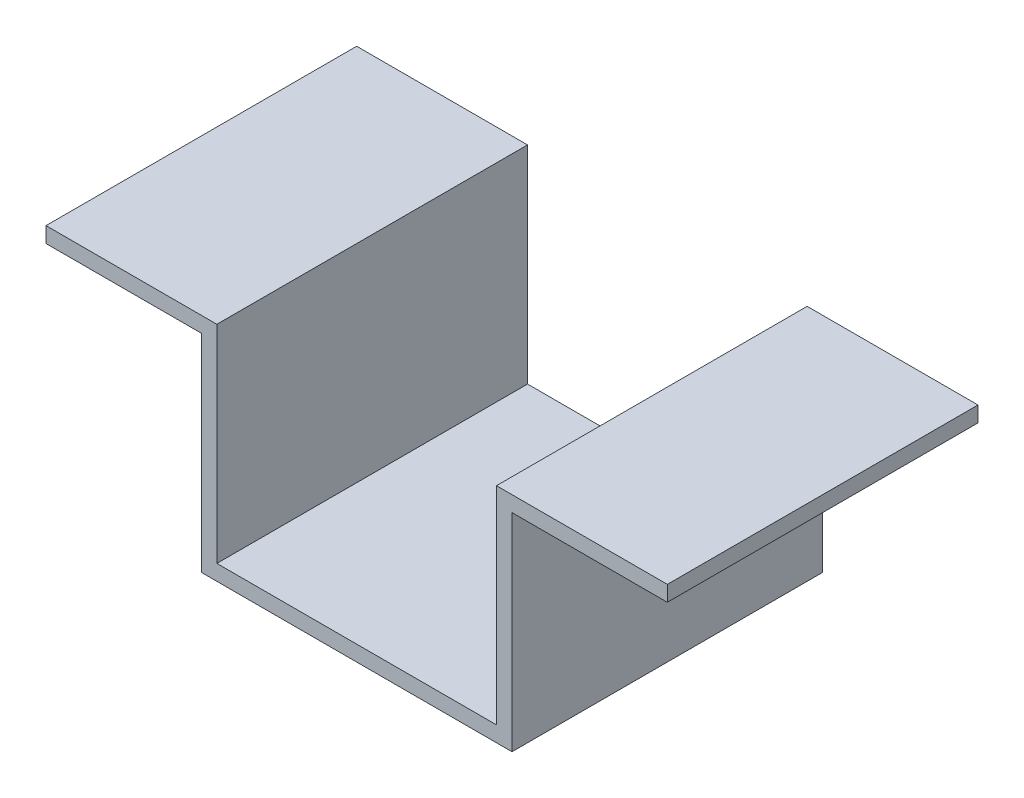
ISO-10303-21;
HEADER;
FILE_DESCRIPTION(('STEP AP214'),'2;1');
FILE_NAME('part.step','',(''),(''),'','','');
FILE_SCHEMA(('AUTOMOTIVE_DESIGN { 1 0 10303 214 1 1 1 1 }'));
ENDSEC;
DATA;
#1=APPLICATION_CONTEXT('core data for automotive mechanical design processes');
#2=APPLICATION_PROTOCOL_DEFINITION('international standard','automotive_design',2000,#1);
#3=PRODUCT_CONTEXT('',#1,'mechanical');
#4=PRODUCT('Part','Part','',(#3));
#5=PRODUCT_RELATED_PRODUCT_CATEGORY('part','',(#4));
#6=PRODUCT_DEFINITION_FORMATION('','',#4);
#7=PRODUCT_DEFINITION_CONTEXT('part definition',#1,'design');
#8=PRODUCT_DEFINITION('design','',#6,#7);
#9=PRODUCT_DEFINITION_SHAPE('','',#8);
#10=(LENGTH_UNIT() NAMED_UNIT(*) SI_UNIT(.MILLI.,.METRE.));
#11=(NAMED_UNIT(*) PLANE_ANGLE_UNIT() SI_UNIT($,.RADIAN.));
#12=(NAMED_UNIT(*) SI_UNIT($,.STERADIAN.) SOLID_ANGLE_UNIT());
#13=UNCERTAINTY_MEASURE_WITH_UNIT(LENGTH_MEASURE(1.E-05),#10,'distance_accuracy_value','');
#14=(GEOMETRIC_REPRESENTATION_CONTEXT(3) GLOBAL_UNCERTAINTY_ASSIGNED_CONTEXT((#13)) GLOBAL_UNIT_ASSIGNED_CONTEXT((#10,
#11,#12)) REPRESENTATION_CONTEXT('',''));
#15=CARTESIAN_POINT('',(0.,0.,0.));
#16=DIRECTION('',(0.,0.,1.));
#17=DIRECTION('',(1.,0.,0.));
#18=AXIS2_PLACEMENT_3D('',#15,#16,#17);
#19=CARTESIAN_POINT('',(-30.,11.5,30.));
#20=DIRECTION('',(1.,0.,0.));
#21=DIRECTION('',(0.,0.,-1.));
#22=AXIS2_PLACEMENT_3D('',#19,#20,#21);
#23=PLANE('',#22);
#24=DIRECTION('',(0.,-1.,0.));
#25=VECTOR('',#24,1.);
#26=CARTESIAN_POINT('',(-30.,11.5,0.));
#27=LINE('',#26,#25);
#28=CARTESIAN_POINT('',(-30.,11.5,0.));
#29=VERTEX_POINT('',#28);
#30=CARTESIAN_POINT('',(-30.,10.,0.));
#31=VERTEX_POINT('',#30);
#32=EDGE_CURVE('E169',#29,#31,#27,.T.);
#33=ORIENTED_EDGE('',*,*,#32,.T.);
#34=DIRECTION('',(0.,0.,-1.));
#35=VECTOR('',#34,1.);
#36=CARTESIAN_POINT('',(-30.,10.,30.));
#37=LINE('',#36,#35);
#38=CARTESIAN_POINT('',(-30.,10.,30.));
#39=VERTEX_POINT('',#38);
#40=EDGE_CURVE('E11',#39,#31,#37,.T.);
#41=ORIENTED_EDGE('',*,*,#40,.F.);
#42=DIRECTION('',(0.,-1.,0.));
#43=VECTOR('',#42,1.);
#44=CARTESIAN_POINT('',(-30.,11.5,30.));
#45=LINE('',#44,#43);
#46=CARTESIAN_POINT('',(-30.,11.5,30.));
#47=VERTEX_POINT('',#46);
#48=EDGE_CURVE('E205',#47,#39,#45,.T.);
#49=ORIENTED_EDGE('',*,*,#48,.F.);
#50=DIRECTION('',(0.,0.,-1.));
#51=VECTOR('',#50,1.);
#52=CARTESIAN_POINT('',(-30.,11.5,30.));
#53=LINE('',#52,#51);
#54=EDGE_CURVE('E165',#47,#29,#53,.T.);
#55=ORIENTED_EDGE('',*,*,#54,.T.);
#56=EDGE_LOOP('',(#33,#41,#49,#55));
#57=FACE_BOUND('',#56,.T.);
#58=ADVANCED_FACE('F45',(#57),#23,.F.);
#59=CARTESIAN_POINT('',(-30.,10.,30.));
#60=DIRECTION('',(0.,1.,0.));
#61=DIRECTION('',(0.,0.,1.));
#62=AXIS2_PLACEMENT_3D('',#59,#60,#61);
#63=PLANE('',#62);
#64=DIRECTION('',(1.,0.,0.));
#65=VECTOR('',#64,1.);
#66=CARTESIAN_POINT('',(-30.,10.,0.));
#67=LINE('',#66,#65);
#68=CARTESIAN_POINT('',(-15.,10.,0.));
#69=VERTEX_POINT('',#68);
#70=EDGE_CURVE('E173',#31,#69,#67,.T.);
#71=ORIENTED_EDGE('',*,*,#70,.T.);
#72=DIRECTION('',(0.,0.,-1.));
#73=VECTOR('',#72,1.);
#74=CARTESIAN_POINT('',(-15.,10.,30.));
#75=LINE('',#74,#73);
#76=CARTESIAN_POINT('',(-15.,10.,30.));
#77=VERTEX_POINT('',#76);
#78=EDGE_CURVE('E54',#77,#69,#75,.T.);
#79=ORIENTED_EDGE('',*,*,#78,.F.);
#80=DIRECTION('',(1.,0.,0.));
#81=VECTOR('',#80,1.);
#82=CARTESIAN_POINT('',(-30.,10.,30.));
#83=LINE('',#82,#81);
#84=EDGE_CURVE('E117',#39,#77,#83,.T.);
#85=ORIENTED_EDGE('',*,*,#84,.F.);
#86=ORIENTED_EDGE('',*,*,#40,.T.);
#87=EDGE_LOOP('',(#71,#79,#85,#86));
#88=FACE_BOUND('',#87,.T.);
#89=ADVANCED_FACE('F299',(#88),#63,.F.);
#90=CARTESIAN_POINT('',(-15.,10.,30.));
#91=DIRECTION('',(1.,0.,0.));
#92=DIRECTION('',(0.,1.,0.));
#93=AXIS2_PLACEMENT_3D('',#90,#91,#92);
#94=PLANE('',#93);
#95=DIRECTION('',(0.,-1.,0.));
#96=VECTOR('',#95,1.);
#97=CARTESIAN_POINT('',(-15.,10.,0.));
#98=LINE('',#97,#96);
#99=CARTESIAN_POINT('',(-15.,-10.,0.));
#100=VERTEX_POINT('',#99);
#101=EDGE_CURVE('E176',#69,#100,#98,.T.);
#102=ORIENTED_EDGE('',*,*,#101,.T.);
#103=DIRECTION('',(0.,0.,-1.));
#104=VECTOR('',#103,1.);
#105=CARTESIAN_POINT('',(-15.,-10.,30.));
#106=LINE('',#105,#104);
#107=CARTESIAN_POINT('',(-15.,-10.,30.));
#108=VERTEX_POINT('',#107);
#109=EDGE_CURVE('E232',#108,#100,#106,.T.);
#110=ORIENTED_EDGE('',*,*,#109,.F.);
#111=DIRECTION('',(0.,-1.,0.));
#112=VECTOR('',#111,1.);
#113=CARTESIAN_POINT('',(-15.,10.,30.));
#114=LINE('',#113,#112);
#115=EDGE_CURVE('E242',#77,#108,#114,.T.);
#116=ORIENTED_EDGE('',*,*,#115,.F.);
#117=ORIENTED_EDGE('',*,*,#78,.T.);
#118=EDGE_LOOP('',(#102,#110,#116,#117));
#119=FACE_BOUND('',#118,.T.);
#120=ADVANCED_FACE('F240',(#119),#94,.F.);
#121=CARTESIAN_POINT('',(15.,-10.,30.));
#122=DIRECTION('',(0.,1.,0.));
#123=DIRECTION('',(0.,0.,1.));
#124=AXIS2_PLACEMENT_3D('',#121,#122,#123);
#125=PLANE('',#124);
#126=DIRECTION('',(1.,0.,0.));
#127=VECTOR('',#126,1.);
#128=CARTESIAN_POINT('',(15.,-10.,0.));
#129=LINE('',#128,#127);
#130=CARTESIAN_POINT('',(15.,-10.,0.));
#131=VERTEX_POINT('',#130);
#132=EDGE_CURVE('E180',#100,#131,#129,.T.);
#133=ORIENTED_EDGE('',*,*,#132,.T.);
#134=DIRECTION('',(0.,0.,-1.));
#135=VECTOR('',#134,1.);
#136=CARTESIAN_POINT('',(15.,-10.,30.));
#137=LINE('',#136,#135);
#138=CARTESIAN_POINT('',(15.,-10.,30.));
#139=VERTEX_POINT('',#138);
#140=EDGE_CURVE('E228',#139,#131,#137,.T.);
#141=ORIENTED_EDGE('',*,*,#140,.F.);
#142=DIRECTION('',(1.,0.,0.));
#143=VECTOR('',#142,1.);
#144=CARTESIAN_POINT('',(-15.,-10.,30.));
#145=LINE('',#144,#143);
#146=EDGE_CURVE('E260',#108,#139,#145,.T.);
#147=ORIENTED_EDGE('',*,*,#146,.F.);
#148=ORIENTED_EDGE('',*,*,#109,.T.);
#149=EDGE_LOOP('',(#133,#141,#147,#148));
#150=FACE_BOUND('',#149,.T.);
#151=ADVANCED_FACE('F250',(#150),#125,.F.);
#152=CARTESIAN_POINT('',(15.,10.,30.));
#153=DIRECTION('',(-1.,0.,0.));
#154=DIRECTION('',(0.,-1.,0.));
#155=AXIS2_PLACEMENT_3D('',#152,#153,#154);
#156=PLANE('',#155);
#157=DIRECTION('',(0.,1.,0.));
#158=VECTOR('',#157,1.);
#159=CARTESIAN_POINT('',(15.,10.,0.));
#160=LINE('',#159,#158);
#161=CARTESIAN_POINT('',(15.,10.,0.));
#162=VERTEX_POINT('',#161);
#163=EDGE_CURVE('E183',#131,#162,#160,.T.);
#164=ORIENTED_EDGE('',*,*,#163,.T.);
#165=DIRECTION('',(0.,0.,-1.));
#166=VECTOR('',#165,1.);
#167=CARTESIAN_POINT('',(15.,10.,30.));
#168=LINE('',#167,#166);
#169=CARTESIAN_POINT('',(15.,10.,30.));
#170=VERTEX_POINT('',#169);
#171=EDGE_CURVE('E224',#170,#162,#168,.T.);
#172=ORIENTED_EDGE('',*,*,#171,.F.);
#173=DIRECTION('',(0.,1.,0.));
#174=VECTOR('',#173,1.);
#175=CARTESIAN_POINT('',(15.,10.,30.));
#176=LINE('',#175,#174);
#177=EDGE_CURVE('E256',#139,#170,#176,.T.);
#178=ORIENTED_EDGE('',*,*,#177,.F.);
#179=ORIENTED_EDGE('',*,*,#140,.T.);
#180=EDGE_LOOP('',(#164,#172,#178,#179));
#181=FACE_BOUND('',#180,.T.);
#182=ADVANCED_FACE('F254',(#181),#156,.F.);
#183=CARTESIAN_POINT('',(30.,10.,30.));
#184=DIRECTION('',(0.,1.,0.));
#185=DIRECTION('',(0.,0.,1.));
#186=AXIS2_PLACEMENT_3D('',#183,#184,#185);
#187=PLANE('',#186);
#188=DIRECTION('',(1.,0.,0.));
#189=VECTOR('',#188,1.);
#190=CARTESIAN_POINT('',(30.,10.,0.));
#191=LINE('',#190,#189);
#192=CARTESIAN_POINT('',(30.,10.,0.));
#193=VERTEX_POINT('',#192);
#194=EDGE_CURVE('E186',#162,#193,#191,.T.);
#195=ORIENTED_EDGE('',*,*,#194,.T.);
#196=DIRECTION('',(0.,0.,-1.));
#197=VECTOR('',#196,1.);
#198=CARTESIAN_POINT('',(30.,10.,30.));
#199=LINE('',#198,#197);
#200=CARTESIAN_POINT('',(30.,10.,30.));
#201=VERTEX_POINT('',#200);
#202=EDGE_CURVE('E220',#201,#193,#199,.T.);
#203=ORIENTED_EDGE('',*,*,#202,.F.);
#204=DIRECTION('',(1.,0.,0.));
#205=VECTOR('',#204,1.);
#206=CARTESIAN_POINT('',(30.,10.,30.));
#207=LINE('',#206,#205);
#208=EDGE_CURVE('E259',#170,#201,#207,.T.);
#209=ORIENTED_EDGE('',*,*,#208,.F.);
#210=ORIENTED_EDGE('',*,*,#171,.T.);
#211=EDGE_LOOP('',(#195,#203,#209,#210));
#212=FACE_BOUND('',#211,.T.);
#213=ADVANCED_FACE('F312',(#212),#187,.F.);
#214=CARTESIAN_POINT('',(30.,11.5,30.));
#215=DIRECTION('',(-1.,0.,0.));
#216=DIRECTION('',(0.,0.,1.));
#217=AXIS2_PLACEMENT_3D('',#214,#215,#216);
#218=PLANE('',#217);
#219=DIRECTION('',(0.,1.,0.));
#220=VECTOR('',#219,1.);
#221=CARTESIAN_POINT('',(30.,11.5,0.));
#222=LINE('',#221,#220);
#223=CARTESIAN_POINT('',(30.,11.5,0.));
#224=VERTEX_POINT('',#223);
#225=EDGE_CURVE('E189',#193,#224,#222,.T.);
#226=ORIENTED_EDGE('',*,*,#225,.T.);
#227=DIRECTION('',(0.,0.,-1.));
#228=VECTOR('',#227,1.);
#229=CARTESIAN_POINT('',(30.,11.5,30.));
#230=LINE('',#229,#228);
#231=CARTESIAN_POINT('',(30.,11.5,30.));
#232=VERTEX_POINT('',#231);
#233=EDGE_CURVE('E216',#232,#224,#230,.T.);
#234=ORIENTED_EDGE('',*,*,#233,.F.);
#235=DIRECTION('',(0.,1.,0.));
#236=VECTOR('',#235,1.);
#237=CARTESIAN_POINT('',(30.,11.5,30.));
#238=LINE('',#237,#236);
#239=EDGE_CURVE('E264',#201,#232,#238,.T.);
#240=ORIENTED_EDGE('',*,*,#239,.F.);
#241=ORIENTED_EDGE('',*,*,#202,.T.);
#242=EDGE_LOOP('',(#226,#234,#240,#241));
#243=FACE_BOUND('',#242,.T.);
#244=ADVANCED_FACE('F315',(#243),#218,.F.);
#245=CARTESIAN_POINT('',(30.,11.5,30.));
#246=DIRECTION('',(0.,-1.,0.));
#247=DIRECTION('',(0.,0.,-1.));
#248=AXIS2_PLACEMENT_3D('',#245,#246,#247);
#249=PLANE('',#248);
#250=DIRECTION('',(-1.,0.,0.));
#251=VECTOR('',#250,1.);
#252=CARTESIAN_POINT('',(30.,11.5,0.));
#253=LINE('',#252,#251);
#254=CARTESIAN_POINT('',(13.5,11.5,0.));
#255=VERTEX_POINT('',#254);
#256=EDGE_CURVE('E192',#224,#255,#253,.T.);
#257=ORIENTED_EDGE('',*,*,#256,.T.);
#258=DIRECTION('',(0.,0.,-1.));
#259=VECTOR('',#258,1.);
#260=CARTESIAN_POINT('',(13.5,11.5,30.));
#261=LINE('',#260,#259);
#262=CARTESIAN_POINT('',(13.5,11.5,30.));
#263=VERTEX_POINT('',#262);
#264=EDGE_CURVE('E212',#263,#255,#261,.T.);
#265=ORIENTED_EDGE('',*,*,#264,.F.);
#266=DIRECTION('',(-1.,0.,0.));
#267=VECTOR('',#266,1.);
#268=CARTESIAN_POINT('',(30.,11.5,30.));
#269=LINE('',#268,#267);
#270=EDGE_CURVE('E271',#232,#263,#269,.T.);
#271=ORIENTED_EDGE('',*,*,#270,.F.);
#272=ORIENTED_EDGE('',*,*,#233,.T.);
#273=EDGE_LOOP('',(#257,#265,#271,#272));
#274=FACE_BOUND('',#273,.T.);
#275=ADVANCED_FACE('F279',(#274),#249,.F.);
#276=CARTESIAN_POINT('',(13.5,11.5,30.));
#277=DIRECTION('',(1.,0.,0.));
#278=DIRECTION('',(0.,1.,0.));
#279=AXIS2_PLACEMENT_3D('',#276,#277,#278);
#280=PLANE('',#279);
#281=DIRECTION('',(0.,-1.,0.));
#282=VECTOR('',#281,1.);
#283=CARTESIAN_POINT('',(13.5,11.5,0.));
#284=LINE('',#283,#282);
#285=CARTESIAN_POINT('',(13.5,-8.5,0.));
#286=VERTEX_POINT('',#285);
#287=EDGE_CURVE('E195',#255,#286,#284,.T.);
#288=ORIENTED_EDGE('',*,*,#287,.T.);
#289=DIRECTION('',(0.,0.,-1.));
#290=VECTOR('',#289,1.);
#291=CARTESIAN_POINT('',(13.5,-8.5,30.));
#292=LINE('',#291,#290);
#293=CARTESIAN_POINT('',(13.5,-8.5,30.));
#294=VERTEX_POINT('',#293);
#295=EDGE_CURVE('E158',#294,#286,#292,.T.);
#296=ORIENTED_EDGE('',*,*,#295,.F.);
#297=DIRECTION('',(0.,-1.,0.));
#298=VECTOR('',#297,1.);
#299=CARTESIAN_POINT('',(13.5,11.5,30.));
#300=LINE('',#299,#298);
#301=EDGE_CURVE('E148',#263,#294,#300,.T.);
#302=ORIENTED_EDGE('',*,*,#301,.F.);
#303=ORIENTED_EDGE('',*,*,#264,.T.);
#304=EDGE_LOOP('',(#288,#296,#302,#303));
#305=FACE_BOUND('',#304,.T.);
#306=ADVANCED_FACE('F283',(#305),#280,.F.);
#307=CARTESIAN_POINT('',(-13.5,-8.5,30.));
#308=DIRECTION('',(0.,-1.,0.));
#309=DIRECTION('',(0.,0.,-1.));
#310=AXIS2_PLACEMENT_3D('',#307,#308,#309);
#311=PLANE('',#310);
#312=DIRECTION('',(-1.,0.,0.));
#313=VECTOR('',#312,1.);
#314=CARTESIAN_POINT('',(-13.5,-8.5,0.));
#315=LINE('',#314,#313);
#316=CARTESIAN_POINT('',(-13.5,-8.5,0.));
#317=VERTEX_POINT('',#316);
#318=EDGE_CURVE('E156',#286,#317,#315,.T.);
#319=ORIENTED_EDGE('',*,*,#318,.T.);
#320=DIRECTION('',(0.,0.,-1.));
#321=VECTOR('',#320,1.);
#322=CARTESIAN_POINT('',(-13.5,-8.5,30.));
#323=LINE('',#322,#321);
#324=CARTESIAN_POINT('',(-13.5,-8.5,30.));
#325=VERTEX_POINT('',#324);
#326=EDGE_CURVE('E154',#325,#317,#323,.T.);
#327=ORIENTED_EDGE('',*,*,#326,.F.);
#328=DIRECTION('',(-1.,0.,0.));
#329=VECTOR('',#328,1.);
#330=CARTESIAN_POINT('',(13.5,-8.5,30.));
#331=LINE('',#330,#329);
#332=EDGE_CURVE('E142',#294,#325,#331,.T.);
#333=ORIENTED_EDGE('',*,*,#332,.F.);
#334=ORIENTED_EDGE('',*,*,#295,.T.);
#335=EDGE_LOOP('',(#319,#327,#333,#334));
#336=FACE_BOUND('',#335,.T.);
#337=ADVANCED_FACE('F155',(#336),#311,.F.);
#338=CARTESIAN_POINT('',(-13.5,11.5,30.));
#339=DIRECTION('',(-1.,0.,0.));
#340=DIRECTION('',(0.,-1.,0.));
#341=AXIS2_PLACEMENT_3D('',#338,#339,#340);
#342=PLANE('',#341);
#343=DIRECTION('',(0.,1.,0.));
#344=VECTOR('',#343,1.);
#345=CARTESIAN_POINT('',(-13.5,11.5,0.));
#346=LINE('',#345,#344);
#347=CARTESIAN_POINT('',(-13.5,11.5,0.));
#348=VERTEX_POINT('',#347);
#349=EDGE_CURVE('E103',#317,#348,#346,.T.);
#350=ORIENTED_EDGE('',*,*,#349,.T.);
#351=DIRECTION('',(0.,0.,-1.));
#352=VECTOR('',#351,1.);
#353=CARTESIAN_POINT('',(-13.5,11.5,30.));
#354=LINE('',#353,#352);
#355=CARTESIAN_POINT('',(-13.5,11.5,30.));
#356=VERTEX_POINT('',#355);
#357=EDGE_CURVE('E159',#356,#348,#354,.T.);
#358=ORIENTED_EDGE('',*,*,#357,.F.);
#359=DIRECTION('',(0.,1.,0.));
#360=VECTOR('',#359,1.);
#361=CARTESIAN_POINT('',(-13.5,11.5,30.));
#362=LINE('',#361,#360);
#363=EDGE_CURVE('E146',#325,#356,#362,.T.);
#364=ORIENTED_EDGE('',*,*,#363,.F.);
#365=ORIENTED_EDGE('',*,*,#326,.T.);
#366=EDGE_LOOP('',(#350,#358,#364,#365));
#367=FACE_BOUND('',#366,.T.);
#368=ADVANCED_FACE('F161',(#367),#342,.F.);
#369=CARTESIAN_POINT('',(-30.,11.5,30.));
#370=DIRECTION('',(0.,-1.,0.));
#371=DIRECTION('',(0.,0.,-1.));
#372=AXIS2_PLACEMENT_3D('',#369,#370,#371);
#373=PLANE('',#372);
#374=DIRECTION('',(-1.,0.,0.));
#375=VECTOR('',#374,1.);
#376=CARTESIAN_POINT('',(-30.,11.5,0.));
#377=LINE('',#376,#375);
#378=EDGE_CURVE('E109',#348,#29,#377,.T.);
#379=ORIENTED_EDGE('',*,*,#378,.T.);
#380=ORIENTED_EDGE('',*,*,#54,.F.);
#381=DIRECTION('',(-1.,0.,0.));
#382=VECTOR('',#381,1.);
#383=CARTESIAN_POINT('',(-30.,11.5,30.));
#384=LINE('',#383,#382);
#385=EDGE_CURVE('E62',#356,#47,#384,.T.);
#386=ORIENTED_EDGE('',*,*,#385,.F.);
#387=ORIENTED_EDGE('',*,*,#357,.T.);
#388=EDGE_LOOP('',(#379,#380,#386,#387));
#389=FACE_BOUND('',#388,.T.);
#390=ADVANCED_FACE('F288',(#389),#373,.F.);
#391=CARTESIAN_POINT('',(0.,0.,30.));
#392=DIRECTION('',(0.,0.,1.));
#393=DIRECTION('',(1.,0.,0.));
#394=AXIS2_PLACEMENT_3D('',#391,#392,#393);
#395=PLANE('',#394);
#396=ORIENTED_EDGE('',*,*,#48,.T.);
#397=ORIENTED_EDGE('',*,*,#84,.T.);
#398=ORIENTED_EDGE('',*,*,#115,.T.);
#399=ORIENTED_EDGE('',*,*,#146,.T.);
#400=ORIENTED_EDGE('',*,*,#177,.T.);
#401=ORIENTED_EDGE('',*,*,#208,.T.);
#402=ORIENTED_EDGE('',*,*,#239,.T.);
#403=ORIENTED_EDGE('',*,*,#270,.T.);
#404=ORIENTED_EDGE('',*,*,#301,.T.);
#405=ORIENTED_EDGE('',*,*,#332,.T.);
#406=ORIENTED_EDGE('',*,*,#363,.T.);
#407=ORIENTED_EDGE('',*,*,#385,.T.);
#408=EDGE_LOOP('',(#396,#397,#398,#399,#400,#401,#402,#403,#404,#405,#406,#407));
#409=FACE_BOUND('',#408,.T.);
#410=ADVANCED_FACE('F144',(#409),#395,.T.);
#411=CARTESIAN_POINT('',(0.,0.,0.));
#412=DIRECTION('',(0.,0.,1.));
#413=DIRECTION('',(1.,0.,0.));
#414=AXIS2_PLACEMENT_3D('',#411,#412,#413);
#415=PLANE('',#414);
#416=ORIENTED_EDGE('',*,*,#32,.F.);
#417=ORIENTED_EDGE('',*,*,#378,.F.);
#418=ORIENTED_EDGE('',*,*,#349,.F.);
#419=ORIENTED_EDGE('',*,*,#318,.F.);
#420=ORIENTED_EDGE('',*,*,#287,.F.);
#421=ORIENTED_EDGE('',*,*,#256,.F.);
#422=ORIENTED_EDGE('',*,*,#225,.F.);
#423=ORIENTED_EDGE('',*,*,#194,.F.);
#424=ORIENTED_EDGE('',*,*,#163,.F.);
#425=ORIENTED_EDGE('',*,*,#132,.F.);
#426=ORIENTED_EDGE('',*,*,#101,.F.);
#427=ORIENTED_EDGE('',*,*,#70,.F.);
#428=EDGE_LOOP('',(#416,#417,#418,#419,#420,#421,#422,#423,#424,#425,#426,#427));
#429=FACE_BOUND('',#428,.T.);
#430=ADVANCED_FACE('F245',(#429),#415,.F.);
#431=CLOSED_SHELL('',(#58,#89,#120,#151,#182,#213,#244,#275,#306,#337,#368,#390,#410,#430));
#432=MANIFOLD_SOLID_BREP('B2',#431);
#433=ADVANCED_BREP_SHAPE_REPRESENTATION('',(#18,#432),#14);
#434=SHAPE_DEFINITION_REPRESENTATION(#9,#433);
ENDSEC;
END-ISO-10303-21;
